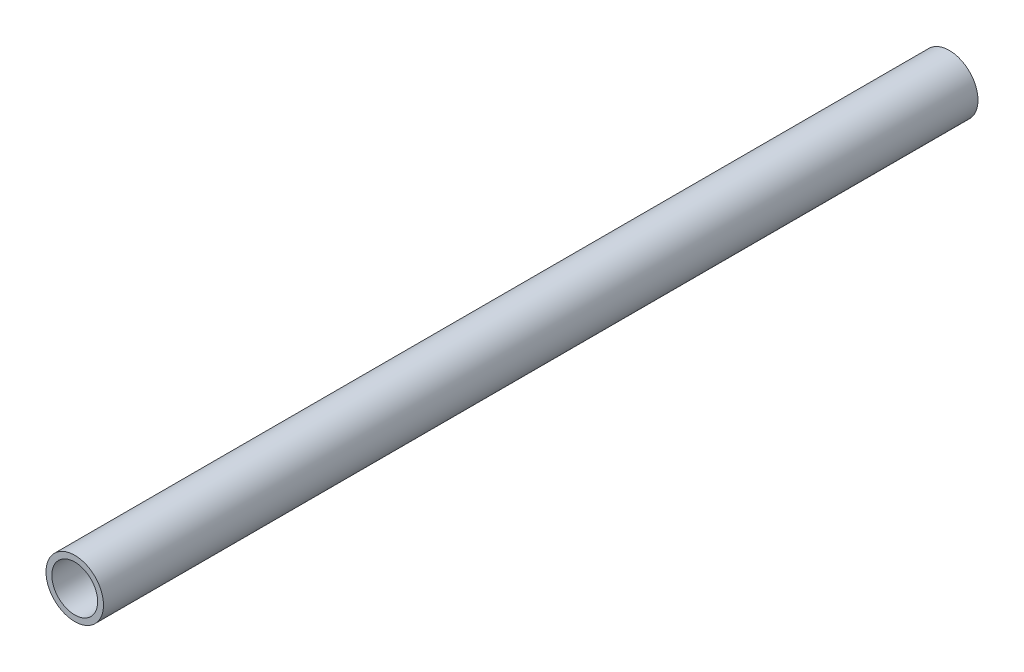
ISO-10303-21;
HEADER;
FILE_DESCRIPTION(('STEP AP214'),'2;1');
FILE_NAME('part.step','',(''),(''),'','','');
FILE_SCHEMA(('AUTOMOTIVE_DESIGN { 1 0 10303 214 1 1 1 1 }'));
ENDSEC;
DATA;
#1=APPLICATION_CONTEXT('core data for automotive mechanical design processes');
#2=APPLICATION_PROTOCOL_DEFINITION('international standard','automotive_design',2000,#1);
#3=PRODUCT_CONTEXT('',#1,'mechanical');
#4=PRODUCT('Part','Part','',(#3));
#5=PRODUCT_RELATED_PRODUCT_CATEGORY('part','',(#4));
#6=PRODUCT_DEFINITION_FORMATION('','',#4);
#7=PRODUCT_DEFINITION_CONTEXT('part definition',#1,'design');
#8=PRODUCT_DEFINITION('design','',#6,#7);
#9=PRODUCT_DEFINITION_SHAPE('','',#8);
#10=(LENGTH_UNIT() NAMED_UNIT(*) SI_UNIT(.MILLI.,.METRE.));
#11=(NAMED_UNIT(*) PLANE_ANGLE_UNIT() SI_UNIT($,.RADIAN.));
#12=(NAMED_UNIT(*) SI_UNIT($,.STERADIAN.) SOLID_ANGLE_UNIT());
#13=UNCERTAINTY_MEASURE_WITH_UNIT(LENGTH_MEASURE(1.E-05),#10,'distance_accuracy_value','');
#14=(GEOMETRIC_REPRESENTATION_CONTEXT(3) GLOBAL_UNCERTAINTY_ASSIGNED_CONTEXT((#13)) GLOBAL_UNIT_ASSIGNED_CONTEXT((#10,
#11,#12)) REPRESENTATION_CONTEXT('',''));
#15=CARTESIAN_POINT('',(0.,0.,0.));
#16=DIRECTION('',(0.,0.,1.));
#17=DIRECTION('',(1.,0.,0.));
#18=AXIS2_PLACEMENT_3D('',#15,#16,#17);
#19=CARTESIAN_POINT('',(0.,0.,0.));
#20=DIRECTION('',(0.,0.,1.));
#21=DIRECTION('',(1.,0.,0.));
#22=AXIS2_PLACEMENT_3D('',#19,#20,#21);
#23=CYLINDRICAL_SURFACE('',#22,13.3223);
#24=CARTESIAN_POINT('',(0.,0.,508.));
#25=DIRECTION('',(0.,0.,1.));
#26=DIRECTION('',(1.,0.,0.));
#27=AXIS2_PLACEMENT_3D('',#24,#25,#26);
#28=CIRCLE('',#27,13.3223);
#29=CARTESIAN_POINT('',(13.3223,0.,508.));
#30=VERTEX_POINT('',#29);
#31=EDGE_CURVE('E9',#30,#30,#28,.T.);
#32=ORIENTED_EDGE('',*,*,#31,.T.);
#33=EDGE_LOOP('',(#32));
#34=FACE_BOUND('',#33,.T.);
#35=CARTESIAN_POINT('',(0.,0.,0.));
#36=DIRECTION('',(0.,0.,1.));
#37=DIRECTION('',(1.,0.,0.));
#38=AXIS2_PLACEMENT_3D('',#35,#36,#37);
#39=CIRCLE('',#38,13.3223);
#40=CARTESIAN_POINT('',(13.3223,0.,0.));
#41=VERTEX_POINT('',#40);
#42=EDGE_CURVE('E28',#41,#41,#39,.T.);
#43=ORIENTED_EDGE('',*,*,#42,.F.);
#44=EDGE_LOOP('',(#43));
#45=FACE_BOUND('',#44,.T.);
#46=ADVANCED_FACE('F14',(#34,#45),#23,.F.);
#47=CARTESIAN_POINT('',(0.,0.,0.));
#48=DIRECTION('',(0.,0.,1.));
#49=DIRECTION('',(1.,0.,0.));
#50=AXIS2_PLACEMENT_3D('',#47,#48,#49);
#51=CYLINDRICAL_SURFACE('',#50,16.7005);
#52=CARTESIAN_POINT('',(0.,0.,508.));
#53=DIRECTION('',(0.,0.,-1.));
#54=DIRECTION('',(0.,-1.,0.));
#55=AXIS2_PLACEMENT_3D('',#52,#53,#54);
#56=CIRCLE('',#55,16.7005);
#57=CARTESIAN_POINT('',(0.,-16.7005,508.));
#58=VERTEX_POINT('',#57);
#59=EDGE_CURVE('E22',#58,#58,#56,.T.);
#60=ORIENTED_EDGE('',*,*,#59,.T.);
#61=EDGE_LOOP('',(#60));
#62=FACE_BOUND('',#61,.T.);
#63=CARTESIAN_POINT('',(0.,0.,0.));
#64=DIRECTION('',(0.,0.,-1.));
#65=DIRECTION('',(0.,-1.,0.));
#66=AXIS2_PLACEMENT_3D('',#63,#64,#65);
#67=CIRCLE('',#66,16.7005);
#68=CARTESIAN_POINT('',(0.,-16.7005,0.));
#69=VERTEX_POINT('',#68);
#70=EDGE_CURVE('E18',#69,#69,#67,.T.);
#71=ORIENTED_EDGE('',*,*,#70,.F.);
#72=EDGE_LOOP('',(#71));
#73=FACE_BOUND('',#72,.T.);
#74=ADVANCED_FACE('F16',(#62,#73),#51,.T.);
#75=CARTESIAN_POINT('',(0.,0.,0.));
#76=DIRECTION('',(0.,0.,1.));
#77=DIRECTION('',(1.,0.,0.));
#78=AXIS2_PLACEMENT_3D('',#75,#76,#77);
#79=PLANE('',#78);
#80=ORIENTED_EDGE('',*,*,#70,.T.);
#81=EDGE_LOOP('',(#80));
#82=FACE_BOUND('',#81,.T.);
#83=ORIENTED_EDGE('',*,*,#42,.T.);
#84=EDGE_LOOP('',(#83));
#85=FACE_BOUND('',#84,.T.);
#86=ADVANCED_FACE('F35',(#82,#85),#79,.F.);
#87=CARTESIAN_POINT('',(0.,0.,508.));
#88=DIRECTION('',(0.,0.,1.));
#89=DIRECTION('',(1.,0.,0.));
#90=AXIS2_PLACEMENT_3D('',#87,#88,#89);
#91=PLANE('',#90);
#92=ORIENTED_EDGE('',*,*,#59,.F.);
#93=EDGE_LOOP('',(#92));
#94=FACE_BOUND('',#93,.T.);
#95=ORIENTED_EDGE('',*,*,#31,.F.);
#96=EDGE_LOOP('',(#95));
#97=FACE_BOUND('',#96,.T.);
#98=ADVANCED_FACE('F44',(#94,#97),#91,.T.);
#99=CLOSED_SHELL('',(#46,#74,#86,#98));
#100=MANIFOLD_SOLID_BREP('B1',#99);
#101=ADVANCED_BREP_SHAPE_REPRESENTATION('',(#18,#100),#14);
#102=SHAPE_DEFINITION_REPRESENTATION(#9,#101);
ENDSEC;
END-ISO-10303-21;
